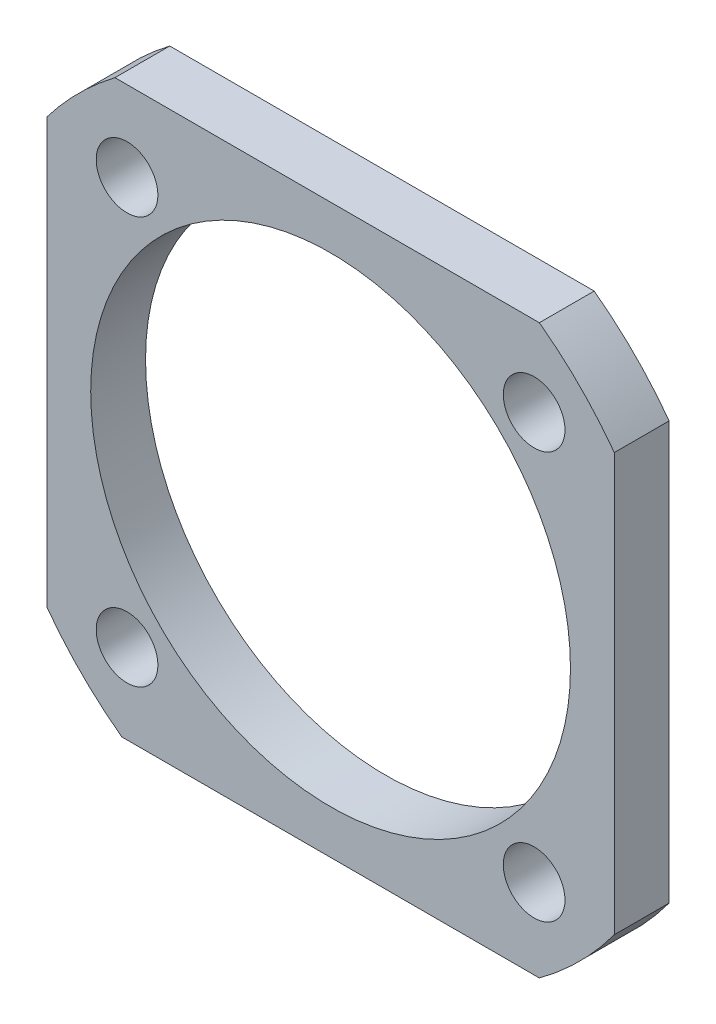
ISO-10303-21;
HEADER;
FILE_DESCRIPTION(('STEP AP214'),'2;1');
FILE_NAME('part.step','',(''),(''),'','','');
FILE_SCHEMA(('AUTOMOTIVE_DESIGN { 1 0 10303 214 1 1 1 1 }'));
ENDSEC;
DATA;
#1=APPLICATION_CONTEXT('core data for automotive mechanical design processes');
#2=APPLICATION_PROTOCOL_DEFINITION('international standard','automotive_design',2000,#1);
#3=PRODUCT_CONTEXT('',#1,'mechanical');
#4=PRODUCT('Part','Part','',(#3));
#5=PRODUCT_RELATED_PRODUCT_CATEGORY('part','',(#4));
#6=PRODUCT_DEFINITION_FORMATION('','',#4);
#7=PRODUCT_DEFINITION_CONTEXT('part definition',#1,'design');
#8=PRODUCT_DEFINITION('design','',#6,#7);
#9=PRODUCT_DEFINITION_SHAPE('','',#8);
#10=(LENGTH_UNIT() NAMED_UNIT(*) SI_UNIT(.MILLI.,.METRE.));
#11=(NAMED_UNIT(*) PLANE_ANGLE_UNIT() SI_UNIT($,.RADIAN.));
#12=(NAMED_UNIT(*) SI_UNIT($,.STERADIAN.) SOLID_ANGLE_UNIT());
#13=UNCERTAINTY_MEASURE_WITH_UNIT(LENGTH_MEASURE(1.E-05),#10,'distance_accuracy_value','');
#14=(GEOMETRIC_REPRESENTATION_CONTEXT(3) GLOBAL_UNCERTAINTY_ASSIGNED_CONTEXT((#13)) GLOBAL_UNIT_ASSIGNED_CONTEXT((#10,
#11,#12)) REPRESENTATION_CONTEXT('',''));
#15=CARTESIAN_POINT('',(0.,0.,0.));
#16=DIRECTION('',(0.,0.,1.));
#17=DIRECTION('',(1.,0.,0.));
#18=AXIS2_PLACEMENT_3D('',#15,#16,#17);
#19=CARTESIAN_POINT('',(0.,0.,4.));
#20=DIRECTION('',(0.,0.,1.));
#21=DIRECTION('',(1.,0.,0.));
#22=AXIS2_PLACEMENT_3D('',#19,#20,#21);
#23=PLANE('',#22);
#24=CARTESIAN_POINT('',(14.8492424049175,-14.8492424049175,4.));
#25=DIRECTION('',(0.,0.,1.));
#26=DIRECTION('',(1.,0.,0.));
#27=AXIS2_PLACEMENT_3D('',#24,#25,#26);
#28=CIRCLE('',#27,2.25);
#29=CARTESIAN_POINT('',(17.0992424049175,-14.8492424049175,4.));
#30=VERTEX_POINT('',#29);
#31=EDGE_CURVE('E194',#30,#30,#28,.T.);
#32=ORIENTED_EDGE('',*,*,#31,.F.);
#33=EDGE_LOOP('',(#32));
#34=FACE_BOUND('',#33,.T.);
#35=CARTESIAN_POINT('',(-14.8492424049175,14.8492424049175,4.));
#36=DIRECTION('',(0.,0.,1.));
#37=DIRECTION('',(1.,0.,0.));
#38=AXIS2_PLACEMENT_3D('',#35,#36,#37);
#39=CIRCLE('',#38,2.25);
#40=CARTESIAN_POINT('',(-12.5992424049175,14.8492424049175,4.));
#41=VERTEX_POINT('',#40);
#42=EDGE_CURVE('E182',#41,#41,#39,.T.);
#43=ORIENTED_EDGE('',*,*,#42,.F.);
#44=EDGE_LOOP('',(#43));
#45=FACE_BOUND('',#44,.T.);
#46=CARTESIAN_POINT('',(0.,0.,4.));
#47=DIRECTION('',(0.,0.,1.));
#48=DIRECTION('',(1.,0.,0.));
#49=AXIS2_PLACEMENT_3D('',#46,#47,#48);
#50=CIRCLE('',#49,26.);
#51=CARTESIAN_POINT('',(-15.7324505402051,20.7,4.));
#52=VERTEX_POINT('',#51);
#53=CARTESIAN_POINT('',(-20.6999999999999,15.7324505402052,4.));
#54=VERTEX_POINT('',#53);
#55=EDGE_CURVE('E145',#52,#54,#50,.T.);
#56=ORIENTED_EDGE('',*,*,#55,.T.);
#57=DIRECTION('',(0.,-1.,0.));
#58=VECTOR('',#57,1.);
#59=CARTESIAN_POINT('',(-20.6999999999999,15.7324505402052,4.));
#60=LINE('',#59,#58);
#61=CARTESIAN_POINT('',(-20.6999999999999,-15.2315462117279,4.));
#62=VERTEX_POINT('',#61);
#63=EDGE_CURVE('E93',#54,#62,#60,.T.);
#64=ORIENTED_EDGE('',*,*,#63,.T.);
#65=CARTESIAN_POINT('',(0.,0.,4.));
#66=DIRECTION('',(0.,0.,1.));
#67=DIRECTION('',(1.,0.,0.));
#68=AXIS2_PLACEMENT_3D('',#65,#66,#67);
#69=CIRCLE('',#68,25.7);
#70=CARTESIAN_POINT('',(-15.2315462117278,-20.7,4.));
#71=VERTEX_POINT('',#70);
#72=EDGE_CURVE('E160',#62,#71,#69,.T.);
#73=ORIENTED_EDGE('',*,*,#72,.T.);
#74=DIRECTION('',(1.,0.,0.));
#75=VECTOR('',#74,1.);
#76=CARTESIAN_POINT('',(-15.2315462117278,-20.7,4.));
#77=LINE('',#76,#75);
#78=CARTESIAN_POINT('',(15.2315462117278,-20.7,4.));
#79=VERTEX_POINT('',#78);
#80=EDGE_CURVE('E173',#71,#79,#77,.T.);
#81=ORIENTED_EDGE('',*,*,#80,.T.);
#82=CARTESIAN_POINT('',(0.,0.,4.));
#83=DIRECTION('',(0.,0.,1.));
#84=DIRECTION('',(1.,0.,0.));
#85=AXIS2_PLACEMENT_3D('',#82,#83,#84);
#86=CIRCLE('',#85,25.7);
#87=CARTESIAN_POINT('',(20.6999999999999,-15.2315462117279,4.));
#88=VERTEX_POINT('',#87);
#89=EDGE_CURVE('E112',#79,#88,#86,.T.);
#90=ORIENTED_EDGE('',*,*,#89,.T.);
#91=DIRECTION('',(0.,1.,0.));
#92=VECTOR('',#91,1.);
#93=CARTESIAN_POINT('',(20.6999999999999,-15.2315462117279,4.));
#94=LINE('',#93,#92);
#95=CARTESIAN_POINT('',(20.6999999999999,15.2315462117279,4.));
#96=VERTEX_POINT('',#95);
#97=EDGE_CURVE('E106',#88,#96,#94,.T.);
#98=ORIENTED_EDGE('',*,*,#97,.T.);
#99=CARTESIAN_POINT('',(0.,0.,4.));
#100=DIRECTION('',(0.,0.,1.));
#101=DIRECTION('',(1.,0.,0.));
#102=AXIS2_PLACEMENT_3D('',#99,#100,#101);
#103=CIRCLE('',#102,25.7);
#104=CARTESIAN_POINT('',(15.2315462117278,20.7,4.));
#105=VERTEX_POINT('',#104);
#106=EDGE_CURVE('E110',#96,#105,#103,.T.);
#107=ORIENTED_EDGE('',*,*,#106,.T.);
#108=DIRECTION('',(-1.,0.,0.));
#109=VECTOR('',#108,1.);
#110=CARTESIAN_POINT('',(15.2315462117278,20.7,4.));
#111=LINE('',#110,#109);
#112=EDGE_CURVE('E50',#105,#52,#111,.T.);
#113=ORIENTED_EDGE('',*,*,#112,.T.);
#114=EDGE_LOOP('',(#56,#64,#73,#81,#90,#98,#107,#113));
#115=FACE_BOUND('',#114,.T.);
#116=CARTESIAN_POINT('',(-14.8492424049175,-14.8492424049175,4.));
#117=DIRECTION('',(0.,0.,1.));
#118=DIRECTION('',(1.,0.,0.));
#119=AXIS2_PLACEMENT_3D('',#116,#117,#118);
#120=CIRCLE('',#119,2.25);
#121=CARTESIAN_POINT('',(-12.5992424049175,-14.8492424049175,4.));
#122=VERTEX_POINT('',#121);
#123=EDGE_CURVE('E134',#122,#122,#120,.T.);
#124=ORIENTED_EDGE('',*,*,#123,.F.);
#125=EDGE_LOOP('',(#124));
#126=FACE_BOUND('',#125,.T.);
#127=CARTESIAN_POINT('',(14.8492424049175,14.8492424049175,4.));
#128=DIRECTION('',(0.,0.,1.));
#129=DIRECTION('',(1.,0.,0.));
#130=AXIS2_PLACEMENT_3D('',#127,#128,#129);
#131=CIRCLE('',#130,2.25);
#132=CARTESIAN_POINT('',(17.0992424049175,14.8492424049175,4.));
#133=VERTEX_POINT('',#132);
#134=EDGE_CURVE('E188',#133,#133,#131,.T.);
#135=ORIENTED_EDGE('',*,*,#134,.F.);
#136=EDGE_LOOP('',(#135));
#137=FACE_BOUND('',#136,.T.);
#138=CARTESIAN_POINT('',(2.21910545362176E-12,0.,4.));
#139=DIRECTION('',(0.,0.,1.));
#140=DIRECTION('',(1.,0.,0.));
#141=AXIS2_PLACEMENT_3D('',#138,#139,#140);
#142=CIRCLE('',#141,17.5);
#143=CARTESIAN_POINT('',(17.5000000000022,0.,4.));
#144=VERTEX_POINT('',#143);
#145=EDGE_CURVE('E200',#144,#144,#142,.T.);
#146=ORIENTED_EDGE('',*,*,#145,.F.);
#147=EDGE_LOOP('',(#146));
#148=FACE_BOUND('',#147,.T.);
#149=ADVANCED_FACE('F33',(#34,#45,#115,#126,#137,#148),#23,.T.);
#150=CARTESIAN_POINT('',(0.,0.,0.));
#151=DIRECTION('',(0.,0.,1.));
#152=DIRECTION('',(1.,0.,0.));
#153=AXIS2_PLACEMENT_3D('',#150,#151,#152);
#154=PLANE('',#153);
#155=CARTESIAN_POINT('',(0.,0.,0.));
#156=DIRECTION('',(0.,0.,1.));
#157=DIRECTION('',(1.,0.,0.));
#158=AXIS2_PLACEMENT_3D('',#155,#156,#157);
#159=CIRCLE('',#158,26.);
#160=CARTESIAN_POINT('',(-15.7324505402051,20.7,0.));
#161=VERTEX_POINT('',#160);
#162=CARTESIAN_POINT('',(-20.6999999999999,15.7324505402052,0.));
#163=VERTEX_POINT('',#162);
#164=EDGE_CURVE('E130',#161,#163,#159,.T.);
#165=ORIENTED_EDGE('',*,*,#164,.F.);
#166=DIRECTION('',(-1.,0.,0.));
#167=VECTOR('',#166,1.);
#168=CARTESIAN_POINT('',(15.2315462117278,20.7,0.));
#169=LINE('',#168,#167);
#170=CARTESIAN_POINT('',(15.2315462117278,20.7,0.));
#171=VERTEX_POINT('',#170);
#172=EDGE_CURVE('E85',#171,#161,#169,.T.);
#173=ORIENTED_EDGE('',*,*,#172,.F.);
#174=CARTESIAN_POINT('',(0.,0.,0.));
#175=DIRECTION('',(0.,0.,1.));
#176=DIRECTION('',(1.,0.,0.));
#177=AXIS2_PLACEMENT_3D('',#174,#175,#176);
#178=CIRCLE('',#177,25.7);
#179=CARTESIAN_POINT('',(20.6999999999999,15.2315462117279,0.));
#180=VERTEX_POINT('',#179);
#181=EDGE_CURVE('E79',#180,#171,#178,.T.);
#182=ORIENTED_EDGE('',*,*,#181,.F.);
#183=DIRECTION('',(0.,1.,0.));
#184=VECTOR('',#183,1.);
#185=CARTESIAN_POINT('',(20.6999999999999,-15.2315462117279,0.));
#186=LINE('',#185,#184);
#187=CARTESIAN_POINT('',(20.6999999999999,-15.2315462117279,0.));
#188=VERTEX_POINT('',#187);
#189=EDGE_CURVE('E120',#188,#180,#186,.T.);
#190=ORIENTED_EDGE('',*,*,#189,.F.);
#191=CARTESIAN_POINT('',(0.,0.,0.));
#192=DIRECTION('',(0.,0.,1.));
#193=DIRECTION('',(1.,0.,0.));
#194=AXIS2_PLACEMENT_3D('',#191,#192,#193);
#195=CIRCLE('',#194,25.7);
#196=CARTESIAN_POINT('',(15.2315462117278,-20.7,0.));
#197=VERTEX_POINT('',#196);
#198=EDGE_CURVE('E140',#197,#188,#195,.T.);
#199=ORIENTED_EDGE('',*,*,#198,.F.);
#200=DIRECTION('',(1.,0.,0.));
#201=VECTOR('',#200,1.);
#202=CARTESIAN_POINT('',(-15.2315462117278,-20.7,0.));
#203=LINE('',#202,#201);
#204=CARTESIAN_POINT('',(-15.2315462117278,-20.7,0.));
#205=VERTEX_POINT('',#204);
#206=EDGE_CURVE('E138',#205,#197,#203,.T.);
#207=ORIENTED_EDGE('',*,*,#206,.F.);
#208=CARTESIAN_POINT('',(0.,0.,0.));
#209=DIRECTION('',(0.,0.,1.));
#210=DIRECTION('',(1.,0.,0.));
#211=AXIS2_PLACEMENT_3D('',#208,#209,#210);
#212=CIRCLE('',#211,25.7);
#213=CARTESIAN_POINT('',(-20.6999999999999,-15.2315462117279,0.));
#214=VERTEX_POINT('',#213);
#215=EDGE_CURVE('E136',#214,#205,#212,.T.);
#216=ORIENTED_EDGE('',*,*,#215,.F.);
#217=DIRECTION('',(0.,-1.,0.));
#218=VECTOR('',#217,1.);
#219=CARTESIAN_POINT('',(-20.6999999999999,15.7324505402052,0.));
#220=LINE('',#219,#218);
#221=EDGE_CURVE('E133',#163,#214,#220,.T.);
#222=ORIENTED_EDGE('',*,*,#221,.F.);
#223=EDGE_LOOP('',(#165,#173,#182,#190,#199,#207,#216,#222));
#224=FACE_BOUND('',#223,.T.);
#225=CARTESIAN_POINT('',(-14.8492424049175,-14.8492424049175,0.));
#226=DIRECTION('',(0.,0.,1.));
#227=DIRECTION('',(1.,0.,0.));
#228=AXIS2_PLACEMENT_3D('',#225,#226,#227);
#229=CIRCLE('',#228,2.25);
#230=CARTESIAN_POINT('',(-12.5992424049175,-14.8492424049175,0.));
#231=VERTEX_POINT('',#230);
#232=EDGE_CURVE('E179',#231,#231,#229,.T.);
#233=ORIENTED_EDGE('',*,*,#232,.T.);
#234=EDGE_LOOP('',(#233));
#235=FACE_BOUND('',#234,.T.);
#236=CARTESIAN_POINT('',(-14.8492424049175,14.8492424049175,0.));
#237=DIRECTION('',(0.,0.,1.));
#238=DIRECTION('',(1.,0.,0.));
#239=AXIS2_PLACEMENT_3D('',#236,#237,#238);
#240=CIRCLE('',#239,2.25);
#241=CARTESIAN_POINT('',(-12.5992424049175,14.8492424049175,0.));
#242=VERTEX_POINT('',#241);
#243=EDGE_CURVE('E185',#242,#242,#240,.T.);
#244=ORIENTED_EDGE('',*,*,#243,.T.);
#245=EDGE_LOOP('',(#244));
#246=FACE_BOUND('',#245,.T.);
#247=CARTESIAN_POINT('',(14.8492424049175,14.8492424049175,0.));
#248=DIRECTION('',(0.,0.,1.));
#249=DIRECTION('',(1.,0.,0.));
#250=AXIS2_PLACEMENT_3D('',#247,#248,#249);
#251=CIRCLE('',#250,2.25);
#252=CARTESIAN_POINT('',(17.0992424049175,14.8492424049175,0.));
#253=VERTEX_POINT('',#252);
#254=EDGE_CURVE('E191',#253,#253,#251,.T.);
#255=ORIENTED_EDGE('',*,*,#254,.T.);
#256=EDGE_LOOP('',(#255));
#257=FACE_BOUND('',#256,.T.);
#258=CARTESIAN_POINT('',(14.8492424049175,-14.8492424049175,0.));
#259=DIRECTION('',(0.,0.,1.));
#260=DIRECTION('',(1.,0.,0.));
#261=AXIS2_PLACEMENT_3D('',#258,#259,#260);
#262=CIRCLE('',#261,2.25);
#263=CARTESIAN_POINT('',(17.0992424049175,-14.8492424049175,0.));
#264=VERTEX_POINT('',#263);
#265=EDGE_CURVE('E197',#264,#264,#262,.T.);
#266=ORIENTED_EDGE('',*,*,#265,.T.);
#267=EDGE_LOOP('',(#266));
#268=FACE_BOUND('',#267,.T.);
#269=CARTESIAN_POINT('',(2.21910545362176E-12,0.,0.));
#270=DIRECTION('',(0.,0.,1.));
#271=DIRECTION('',(1.,0.,0.));
#272=AXIS2_PLACEMENT_3D('',#269,#270,#271);
#273=CIRCLE('',#272,17.5);
#274=CARTESIAN_POINT('',(17.5000000000022,0.,0.));
#275=VERTEX_POINT('',#274);
#276=EDGE_CURVE('E203',#275,#275,#273,.T.);
#277=ORIENTED_EDGE('',*,*,#276,.T.);
#278=EDGE_LOOP('',(#277));
#279=FACE_BOUND('',#278,.T.);
#280=ADVANCED_FACE('F164',(#224,#235,#246,#257,#268,#279),#154,.F.);
#281=CARTESIAN_POINT('',(0.,0.,4.));
#282=DIRECTION('',(0.,0.,-1.));
#283=DIRECTION('',(-1.,0.,0.));
#284=AXIS2_PLACEMENT_3D('',#281,#282,#283);
#285=CYLINDRICAL_SURFACE('',#284,26.);
#286=ORIENTED_EDGE('',*,*,#164,.T.);
#287=DIRECTION('',(0.,0.,-1.));
#288=VECTOR('',#287,1.);
#289=CARTESIAN_POINT('',(-20.6999999999999,15.7324505402052,4.));
#290=LINE('',#289,#288);
#291=EDGE_CURVE('E11',#54,#163,#290,.T.);
#292=ORIENTED_EDGE('',*,*,#291,.F.);
#293=ORIENTED_EDGE('',*,*,#55,.F.);
#294=DIRECTION('',(0.,0.,-1.));
#295=VECTOR('',#294,1.);
#296=CARTESIAN_POINT('',(-15.7324505402051,20.7,4.));
#297=LINE('',#296,#295);
#298=EDGE_CURVE('E126',#52,#161,#297,.T.);
#299=ORIENTED_EDGE('',*,*,#298,.T.);
#300=EDGE_LOOP('',(#286,#292,#293,#299));
#301=FACE_BOUND('',#300,.T.);
#302=ADVANCED_FACE('F35',(#301),#285,.T.);
#303=CARTESIAN_POINT('',(-20.6999999999999,15.7324505402052,4.));
#304=DIRECTION('',(1.,0.,0.));
#305=DIRECTION('',(0.,0.,-1.));
#306=AXIS2_PLACEMENT_3D('',#303,#304,#305);
#307=PLANE('',#306);
#308=ORIENTED_EDGE('',*,*,#221,.T.);
#309=DIRECTION('',(0.,0.,-1.));
#310=VECTOR('',#309,1.);
#311=CARTESIAN_POINT('',(-20.6999999999999,-15.2315462117279,4.));
#312=LINE('',#311,#310);
#313=EDGE_CURVE('E42',#62,#214,#312,.T.);
#314=ORIENTED_EDGE('',*,*,#313,.F.);
#315=ORIENTED_EDGE('',*,*,#63,.F.);
#316=ORIENTED_EDGE('',*,*,#291,.T.);
#317=EDGE_LOOP('',(#308,#314,#315,#316));
#318=FACE_BOUND('',#317,.T.);
#319=ADVANCED_FACE('F237',(#318),#307,.F.);
#320=CARTESIAN_POINT('',(0.,0.,4.));
#321=DIRECTION('',(0.,0.,-1.));
#322=DIRECTION('',(-1.,0.,0.));
#323=AXIS2_PLACEMENT_3D('',#320,#321,#322);
#324=CYLINDRICAL_SURFACE('',#323,25.7);
#325=ORIENTED_EDGE('',*,*,#215,.T.);
#326=DIRECTION('',(0.,0.,-1.));
#327=VECTOR('',#326,1.);
#328=CARTESIAN_POINT('',(-15.2315462117278,-20.7,4.));
#329=LINE('',#328,#327);
#330=EDGE_CURVE('E152',#71,#205,#329,.T.);
#331=ORIENTED_EDGE('',*,*,#330,.F.);
#332=ORIENTED_EDGE('',*,*,#72,.F.);
#333=ORIENTED_EDGE('',*,*,#313,.T.);
#334=EDGE_LOOP('',(#325,#331,#332,#333));
#335=FACE_BOUND('',#334,.T.);
#336=ADVANCED_FACE('F158',(#335),#324,.T.);
#337=CARTESIAN_POINT('',(-15.2315462117278,-20.7,4.));
#338=DIRECTION('',(0.,1.,0.));
#339=DIRECTION('',(-1.,0.,0.));
#340=AXIS2_PLACEMENT_3D('',#337,#338,#339);
#341=PLANE('',#340);
#342=ORIENTED_EDGE('',*,*,#206,.T.);
#343=DIRECTION('',(0.,0.,-1.));
#344=VECTOR('',#343,1.);
#345=CARTESIAN_POINT('',(15.2315462117278,-20.7,4.));
#346=LINE('',#345,#344);
#347=EDGE_CURVE('E149',#79,#197,#346,.T.);
#348=ORIENTED_EDGE('',*,*,#347,.F.);
#349=ORIENTED_EDGE('',*,*,#80,.F.);
#350=ORIENTED_EDGE('',*,*,#330,.T.);
#351=EDGE_LOOP('',(#342,#348,#349,#350));
#352=FACE_BOUND('',#351,.T.);
#353=ADVANCED_FACE('F169',(#352),#341,.F.);
#354=CARTESIAN_POINT('',(0.,0.,4.));
#355=DIRECTION('',(0.,0.,-1.));
#356=DIRECTION('',(-1.,0.,0.));
#357=AXIS2_PLACEMENT_3D('',#354,#355,#356);
#358=CYLINDRICAL_SURFACE('',#357,25.7);
#359=ORIENTED_EDGE('',*,*,#198,.T.);
#360=DIRECTION('',(0.,0.,-1.));
#361=VECTOR('',#360,1.);
#362=CARTESIAN_POINT('',(20.6999999999999,-15.2315462117279,4.));
#363=LINE('',#362,#361);
#364=EDGE_CURVE('E121',#88,#188,#363,.T.);
#365=ORIENTED_EDGE('',*,*,#364,.F.);
#366=ORIENTED_EDGE('',*,*,#89,.F.);
#367=ORIENTED_EDGE('',*,*,#347,.T.);
#368=EDGE_LOOP('',(#359,#365,#366,#367));
#369=FACE_BOUND('',#368,.T.);
#370=ADVANCED_FACE('F172',(#369),#358,.T.);
#371=CARTESIAN_POINT('',(20.6999999999999,-15.2315462117279,4.));
#372=DIRECTION('',(-1.,0.,0.));
#373=DIRECTION('',(0.,0.,1.));
#374=AXIS2_PLACEMENT_3D('',#371,#372,#373);
#375=PLANE('',#374);
#376=ORIENTED_EDGE('',*,*,#189,.T.);
#377=DIRECTION('',(0.,0.,-1.));
#378=VECTOR('',#377,1.);
#379=CARTESIAN_POINT('',(20.6999999999999,15.2315462117279,4.));
#380=LINE('',#379,#378);
#381=EDGE_CURVE('E117',#96,#180,#380,.T.);
#382=ORIENTED_EDGE('',*,*,#381,.F.);
#383=ORIENTED_EDGE('',*,*,#97,.F.);
#384=ORIENTED_EDGE('',*,*,#364,.T.);
#385=EDGE_LOOP('',(#376,#382,#383,#384));
#386=FACE_BOUND('',#385,.T.);
#387=ADVANCED_FACE('F118',(#386),#375,.F.);
#388=CARTESIAN_POINT('',(0.,0.,4.));
#389=DIRECTION('',(0.,0.,-1.));
#390=DIRECTION('',(-1.,0.,0.));
#391=AXIS2_PLACEMENT_3D('',#388,#389,#390);
#392=CYLINDRICAL_SURFACE('',#391,25.7);
#393=ORIENTED_EDGE('',*,*,#181,.T.);
#394=DIRECTION('',(0.,0.,-1.));
#395=VECTOR('',#394,1.);
#396=CARTESIAN_POINT('',(15.2315462117278,20.7,4.));
#397=LINE('',#396,#395);
#398=EDGE_CURVE('E122',#105,#171,#397,.T.);
#399=ORIENTED_EDGE('',*,*,#398,.F.);
#400=ORIENTED_EDGE('',*,*,#106,.F.);
#401=ORIENTED_EDGE('',*,*,#381,.T.);
#402=EDGE_LOOP('',(#393,#399,#400,#401));
#403=FACE_BOUND('',#402,.T.);
#404=ADVANCED_FACE('F124',(#403),#392,.T.);
#405=CARTESIAN_POINT('',(15.2315462117278,20.7,4.));
#406=DIRECTION('',(0.,-1.,0.));
#407=DIRECTION('',(1.,0.,0.));
#408=AXIS2_PLACEMENT_3D('',#405,#406,#407);
#409=PLANE('',#408);
#410=ORIENTED_EDGE('',*,*,#172,.T.);
#411=ORIENTED_EDGE('',*,*,#298,.F.);
#412=ORIENTED_EDGE('',*,*,#112,.F.);
#413=ORIENTED_EDGE('',*,*,#398,.T.);
#414=EDGE_LOOP('',(#410,#411,#412,#413));
#415=FACE_BOUND('',#414,.T.);
#416=ADVANCED_FACE('F225',(#415),#409,.F.);
#417=CARTESIAN_POINT('',(-14.8492424049175,-14.8492424049175,4.));
#418=DIRECTION('',(0.,0.,-1.));
#419=DIRECTION('',(-1.,0.,0.));
#420=AXIS2_PLACEMENT_3D('',#417,#418,#419);
#421=CYLINDRICAL_SURFACE('',#420,2.25);
#422=ORIENTED_EDGE('',*,*,#123,.T.);
#423=EDGE_LOOP('',(#422));
#424=FACE_BOUND('',#423,.T.);
#425=ORIENTED_EDGE('',*,*,#232,.F.);
#426=EDGE_LOOP('',(#425));
#427=FACE_BOUND('',#426,.T.);
#428=ADVANCED_FACE('F222',(#424,#427),#421,.F.);
#429=CARTESIAN_POINT('',(-14.8492424049175,14.8492424049175,4.));
#430=DIRECTION('',(0.,0.,-1.));
#431=DIRECTION('',(-1.,0.,0.));
#432=AXIS2_PLACEMENT_3D('',#429,#430,#431);
#433=CYLINDRICAL_SURFACE('',#432,2.25);
#434=ORIENTED_EDGE('',*,*,#42,.T.);
#435=EDGE_LOOP('',(#434));
#436=FACE_BOUND('',#435,.T.);
#437=ORIENTED_EDGE('',*,*,#243,.F.);
#438=EDGE_LOOP('',(#437));
#439=FACE_BOUND('',#438,.T.);
#440=ADVANCED_FACE('F301',(#436,#439),#433,.F.);
#441=CARTESIAN_POINT('',(14.8492424049175,14.8492424049175,4.));
#442=DIRECTION('',(0.,0.,-1.));
#443=DIRECTION('',(-1.,0.,0.));
#444=AXIS2_PLACEMENT_3D('',#441,#442,#443);
#445=CYLINDRICAL_SURFACE('',#444,2.25);
#446=ORIENTED_EDGE('',*,*,#134,.T.);
#447=EDGE_LOOP('',(#446));
#448=FACE_BOUND('',#447,.T.);
#449=ORIENTED_EDGE('',*,*,#254,.F.);
#450=EDGE_LOOP('',(#449));
#451=FACE_BOUND('',#450,.T.);
#452=ADVANCED_FACE('F309',(#448,#451),#445,.F.);
#453=CARTESIAN_POINT('',(14.8492424049175,-14.8492424049175,4.));
#454=DIRECTION('',(0.,0.,-1.));
#455=DIRECTION('',(-1.,0.,0.));
#456=AXIS2_PLACEMENT_3D('',#453,#454,#455);
#457=CYLINDRICAL_SURFACE('',#456,2.25);
#458=ORIENTED_EDGE('',*,*,#31,.T.);
#459=EDGE_LOOP('',(#458));
#460=FACE_BOUND('',#459,.T.);
#461=ORIENTED_EDGE('',*,*,#265,.F.);
#462=EDGE_LOOP('',(#461));
#463=FACE_BOUND('',#462,.T.);
#464=ADVANCED_FACE('F317',(#460,#463),#457,.F.);
#465=CARTESIAN_POINT('',(2.21910545362176E-12,0.,4.));
#466=DIRECTION('',(0.,0.,-1.));
#467=DIRECTION('',(-1.,0.,0.));
#468=AXIS2_PLACEMENT_3D('',#465,#466,#467);
#469=CYLINDRICAL_SURFACE('',#468,17.5);
#470=ORIENTED_EDGE('',*,*,#145,.T.);
#471=EDGE_LOOP('',(#470));
#472=FACE_BOUND('',#471,.T.);
#473=ORIENTED_EDGE('',*,*,#276,.F.);
#474=EDGE_LOOP('',(#473));
#475=FACE_BOUND('',#474,.T.);
#476=ADVANCED_FACE('F209',(#472,#475),#469,.F.);
#477=CLOSED_SHELL('',(#149,#280,#302,#319,#336,#353,#370,#387,#404,#416,#428,#440,#452,#464,#476));
#478=MANIFOLD_SOLID_BREP('B2',#477);
#479=ADVANCED_BREP_SHAPE_REPRESENTATION('',(#18,#478),#14);
#480=SHAPE_DEFINITION_REPRESENTATION(#9,#479);
ENDSEC;
END-ISO-10303-21;
